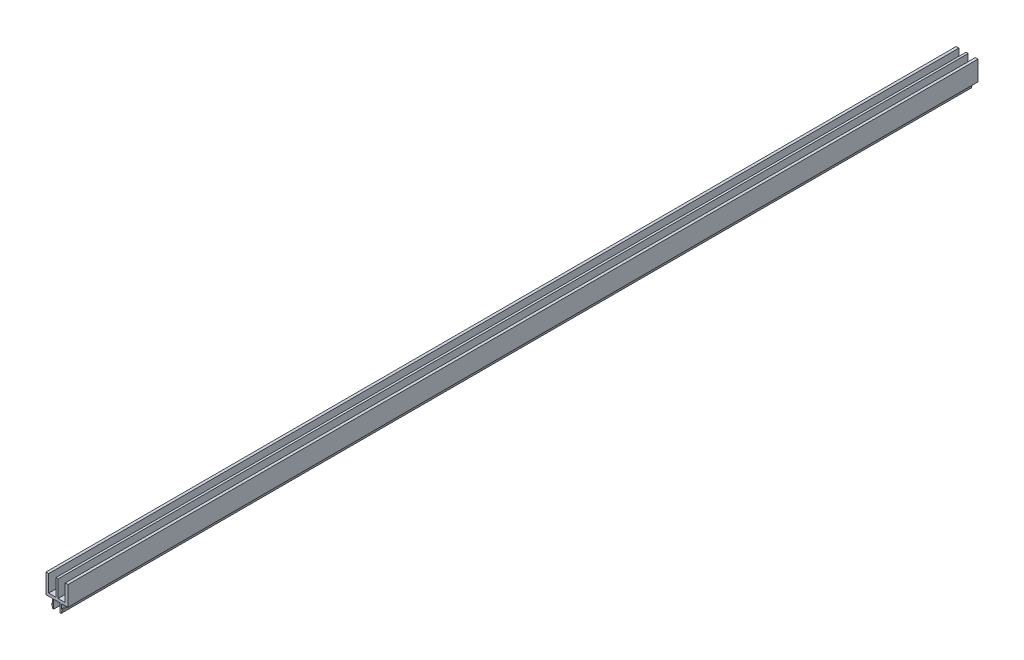
ISO-10303-21;
HEADER;
FILE_DESCRIPTION(('STEP AP214'),'2;1');
FILE_NAME('part.step','',(''),(''),'','','');
FILE_SCHEMA(('AUTOMOTIVE_DESIGN { 1 0 10303 214 1 1 1 1 }'));
ENDSEC;
DATA;
#1=APPLICATION_CONTEXT('core data for automotive mechanical design processes');
#2=APPLICATION_PROTOCOL_DEFINITION('international standard','automotive_design',2000,#1);
#3=PRODUCT_CONTEXT('',#1,'mechanical');
#4=PRODUCT('Part','Part','',(#3));
#5=PRODUCT_RELATED_PRODUCT_CATEGORY('part','',(#4));
#6=PRODUCT_DEFINITION_FORMATION('','',#4);
#7=PRODUCT_DEFINITION_CONTEXT('part definition',#1,'design');
#8=PRODUCT_DEFINITION('design','',#6,#7);
#9=PRODUCT_DEFINITION_SHAPE('','',#8);
#10=(LENGTH_UNIT() NAMED_UNIT(*) SI_UNIT(.MILLI.,.METRE.));
#11=(NAMED_UNIT(*) PLANE_ANGLE_UNIT() SI_UNIT($,.RADIAN.));
#12=(NAMED_UNIT(*) SI_UNIT($,.STERADIAN.) SOLID_ANGLE_UNIT());
#13=UNCERTAINTY_MEASURE_WITH_UNIT(LENGTH_MEASURE(1.E-05),#10,'distance_accuracy_value','');
#14=(GEOMETRIC_REPRESENTATION_CONTEXT(3) GLOBAL_UNCERTAINTY_ASSIGNED_CONTEXT((#13)) GLOBAL_UNIT_ASSIGNED_CONTEXT((#10,
#11,#12)) REPRESENTATION_CONTEXT('',''));
#15=CARTESIAN_POINT('',(0.,0.,0.));
#16=DIRECTION('',(0.,0.,1.));
#17=DIRECTION('',(1.,0.,0.));
#18=AXIS2_PLACEMENT_3D('',#15,#16,#17);
#19=CARTESIAN_POINT('',(-1.,17.9999999975,-782.));
#20=DIRECTION('',(-1.,0.,0.));
#21=DIRECTION('',(0.,-1.,0.));
#22=AXIS2_PLACEMENT_3D('',#19,#20,#21);
#23=PLANE('',#22);
#24=DIRECTION('',(0.,-1.,0.));
#25=VECTOR('',#24,1.);
#26=CARTESIAN_POINT('',(-1.,17.9999999975,50.));
#27=LINE('',#26,#25);
#28=CARTESIAN_POINT('',(-1.,17.9999999975,50.));
#29=VERTEX_POINT('',#28);
#30=CARTESIAN_POINT('',(-1.,2.4999999995,50.));
#31=VERTEX_POINT('',#30);
#32=EDGE_CURVE('E226',#29,#31,#27,.T.);
#33=ORIENTED_EDGE('',*,*,#32,.F.);
#34=DIRECTION('',(0.,0.,1.));
#35=VECTOR('',#34,1.);
#36=CARTESIAN_POINT('',(-1.,17.9999999975,-782.));
#37=LINE('',#36,#35);
#38=CARTESIAN_POINT('',(-1.,17.9999999975,-782.));
#39=VERTEX_POINT('',#38);
#40=EDGE_CURVE('E11',#39,#29,#37,.T.);
#41=ORIENTED_EDGE('',*,*,#40,.F.);
#42=DIRECTION('',(0.,-1.,0.));
#43=VECTOR('',#42,1.);
#44=CARTESIAN_POINT('',(-1.,17.9999999975,-782.));
#45=LINE('',#44,#43);
#46=CARTESIAN_POINT('',(-1.,2.4999999995,-782.));
#47=VERTEX_POINT('',#46);
#48=EDGE_CURVE('E294',#39,#47,#45,.T.);
#49=ORIENTED_EDGE('',*,*,#48,.T.);
#50=DIRECTION('',(0.,0.,1.));
#51=VECTOR('',#50,1.);
#52=CARTESIAN_POINT('',(-1.,2.4999999995,-782.));
#53=LINE('',#52,#51);
#54=EDGE_CURVE('E36',#47,#31,#53,.T.);
#55=ORIENTED_EDGE('',*,*,#54,.T.);
#56=EDGE_LOOP('',(#33,#41,#49,#55));
#57=FACE_BOUND('',#56,.T.);
#58=ADVANCED_FACE('F33',(#57),#23,.T.);
#59=CARTESIAN_POINT('',(0.999999999999998,17.9999999975,-782.));
#60=DIRECTION('',(0.,1.,0.));
#61=DIRECTION('',(0.,0.,1.));
#62=AXIS2_PLACEMENT_3D('',#59,#60,#61);
#63=PLANE('',#62);
#64=DIRECTION('',(-1.,0.,0.));
#65=VECTOR('',#64,1.);
#66=CARTESIAN_POINT('',(0.999999999999998,17.9999999975,50.));
#67=LINE('',#66,#65);
#68=CARTESIAN_POINT('',(0.999999999999998,17.9999999975,50.));
#69=VERTEX_POINT('',#68);
#70=EDGE_CURVE('E292',#69,#29,#67,.T.);
#71=ORIENTED_EDGE('',*,*,#70,.F.);
#72=DIRECTION('',(0.,0.,1.));
#73=VECTOR('',#72,1.);
#74=CARTESIAN_POINT('',(0.999999999999998,17.9999999975,-782.));
#75=LINE('',#74,#73);
#76=CARTESIAN_POINT('',(0.999999999999998,17.9999999975,-782.));
#77=VERTEX_POINT('',#76);
#78=EDGE_CURVE('E42',#77,#69,#75,.T.);
#79=ORIENTED_EDGE('',*,*,#78,.F.);
#80=DIRECTION('',(-1.,0.,0.));
#81=VECTOR('',#80,1.);
#82=CARTESIAN_POINT('',(0.999999999999998,17.9999999975,-782.));
#83=LINE('',#82,#81);
#84=EDGE_CURVE('E216',#77,#39,#83,.T.);
#85=ORIENTED_EDGE('',*,*,#84,.T.);
#86=ORIENTED_EDGE('',*,*,#40,.T.);
#87=EDGE_LOOP('',(#71,#79,#85,#86));
#88=FACE_BOUND('',#87,.T.);
#89=ADVANCED_FACE('F338',(#88),#63,.T.);
#90=CARTESIAN_POINT('',(0.999999999999998,2.4999999995,-782.));
#91=DIRECTION('',(1.,0.,0.));
#92=DIRECTION('',(0.,0.,-1.));
#93=AXIS2_PLACEMENT_3D('',#90,#91,#92);
#94=PLANE('',#93);
#95=DIRECTION('',(0.,1.,0.));
#96=VECTOR('',#95,1.);
#97=CARTESIAN_POINT('',(0.999999999999998,2.4999999995,50.));
#98=LINE('',#97,#96);
#99=CARTESIAN_POINT('',(0.999999999999998,2.4999999995,50.));
#100=VERTEX_POINT('',#99);
#101=EDGE_CURVE('E203',#100,#69,#98,.T.);
#102=ORIENTED_EDGE('',*,*,#101,.F.);
#103=DIRECTION('',(0.,0.,1.));
#104=VECTOR('',#103,1.);
#105=CARTESIAN_POINT('',(0.999999999999998,2.4999999995,-782.));
#106=LINE('',#105,#104);
#107=CARTESIAN_POINT('',(0.999999999999998,2.4999999995,-782.));
#108=VERTEX_POINT('',#107);
#109=EDGE_CURVE('E198',#108,#100,#106,.T.);
#110=ORIENTED_EDGE('',*,*,#109,.F.);
#111=DIRECTION('',(0.,1.,0.));
#112=VECTOR('',#111,1.);
#113=CARTESIAN_POINT('',(0.999999999999998,2.4999999995,-782.));
#114=LINE('',#113,#112);
#115=EDGE_CURVE('E201',#108,#77,#114,.T.);
#116=ORIENTED_EDGE('',*,*,#115,.T.);
#117=ORIENTED_EDGE('',*,*,#78,.T.);
#118=EDGE_LOOP('',(#102,#110,#116,#117));
#119=FACE_BOUND('',#118,.T.);
#120=ADVANCED_FACE('F200',(#119),#94,.T.);
#121=CARTESIAN_POINT('',(7.5,2.4999999995,-782.));
#122=DIRECTION('',(0.,1.,0.));
#123=DIRECTION('',(-1.,0.,0.));
#124=AXIS2_PLACEMENT_3D('',#121,#122,#123);
#125=PLANE('',#124);
#126=DIRECTION('',(-1.,0.,0.));
#127=VECTOR('',#126,1.);
#128=CARTESIAN_POINT('',(7.5,2.4999999995,50.));
#129=LINE('',#128,#127);
#130=CARTESIAN_POINT('',(7.5,2.4999999995,50.));
#131=VERTEX_POINT('',#130);
#132=EDGE_CURVE('E289',#131,#100,#129,.T.);
#133=ORIENTED_EDGE('',*,*,#132,.F.);
#134=DIRECTION('',(0.,0.,1.));
#135=VECTOR('',#134,1.);
#136=CARTESIAN_POINT('',(7.5,2.4999999995,-782.));
#137=LINE('',#136,#135);
#138=CARTESIAN_POINT('',(7.5,2.4999999995,-782.));
#139=VERTEX_POINT('',#138);
#140=EDGE_CURVE('E208',#139,#131,#137,.T.);
#141=ORIENTED_EDGE('',*,*,#140,.F.);
#142=DIRECTION('',(-1.,0.,0.));
#143=VECTOR('',#142,1.);
#144=CARTESIAN_POINT('',(7.5,2.4999999995,-782.));
#145=LINE('',#144,#143);
#146=EDGE_CURVE('E214',#139,#108,#145,.T.);
#147=ORIENTED_EDGE('',*,*,#146,.T.);
#148=ORIENTED_EDGE('',*,*,#109,.T.);
#149=EDGE_LOOP('',(#133,#141,#147,#148));
#150=FACE_BOUND('',#149,.T.);
#151=ADVANCED_FACE('F218',(#150),#125,.T.);
#152=CARTESIAN_POINT('',(7.5,17.9999999975,-782.));
#153=DIRECTION('',(-1.,0.,0.));
#154=DIRECTION('',(0.,-1.,0.));
#155=AXIS2_PLACEMENT_3D('',#152,#153,#154);
#156=PLANE('',#155);
#157=DIRECTION('',(0.,-1.,0.));
#158=VECTOR('',#157,1.);
#159=CARTESIAN_POINT('',(7.5,17.9999999975,50.));
#160=LINE('',#159,#158);
#161=CARTESIAN_POINT('',(7.5,17.9999999975,50.));
#162=VERTEX_POINT('',#161);
#163=EDGE_CURVE('E286',#162,#131,#160,.T.);
#164=ORIENTED_EDGE('',*,*,#163,.F.);
#165=DIRECTION('',(0.,0.,1.));
#166=VECTOR('',#165,1.);
#167=CARTESIAN_POINT('',(7.5,17.9999999975,-782.));
#168=LINE('',#167,#166);
#169=CARTESIAN_POINT('',(7.5,17.9999999975,-782.));
#170=VERTEX_POINT('',#169);
#171=EDGE_CURVE('E298',#170,#162,#168,.T.);
#172=ORIENTED_EDGE('',*,*,#171,.F.);
#173=DIRECTION('',(0.,-1.,0.));
#174=VECTOR('',#173,1.);
#175=CARTESIAN_POINT('',(7.5,17.9999999975,-782.));
#176=LINE('',#175,#174);
#177=EDGE_CURVE('E219',#170,#139,#176,.T.);
#178=ORIENTED_EDGE('',*,*,#177,.T.);
#179=ORIENTED_EDGE('',*,*,#140,.T.);
#180=EDGE_LOOP('',(#164,#172,#178,#179));
#181=FACE_BOUND('',#180,.T.);
#182=ADVANCED_FACE('F351',(#181),#156,.T.);
#183=CARTESIAN_POINT('',(10.,17.9999999975,-782.));
#184=DIRECTION('',(0.,1.,0.));
#185=DIRECTION('',(0.,0.,1.));
#186=AXIS2_PLACEMENT_3D('',#183,#184,#185);
#187=PLANE('',#186);
#188=DIRECTION('',(-1.,0.,0.));
#189=VECTOR('',#188,1.);
#190=CARTESIAN_POINT('',(10.,17.9999999975,50.));
#191=LINE('',#190,#189);
#192=CARTESIAN_POINT('',(10.,17.9999999975,50.));
#193=VERTEX_POINT('',#192);
#194=EDGE_CURVE('E283',#193,#162,#191,.T.);
#195=ORIENTED_EDGE('',*,*,#194,.F.);
#196=DIRECTION('',(0.,0.,1.));
#197=VECTOR('',#196,1.);
#198=CARTESIAN_POINT('',(10.,17.9999999975,-782.));
#199=LINE('',#198,#197);
#200=CARTESIAN_POINT('',(10.,17.9999999975,-782.));
#201=VERTEX_POINT('',#200);
#202=EDGE_CURVE('E300',#201,#193,#199,.T.);
#203=ORIENTED_EDGE('',*,*,#202,.F.);
#204=DIRECTION('',(-1.,0.,0.));
#205=VECTOR('',#204,1.);
#206=CARTESIAN_POINT('',(10.,17.9999999975,-782.));
#207=LINE('',#206,#205);
#208=EDGE_CURVE('E221',#201,#170,#207,.T.);
#209=ORIENTED_EDGE('',*,*,#208,.T.);
#210=ORIENTED_EDGE('',*,*,#171,.T.);
#211=EDGE_LOOP('',(#195,#203,#209,#210));
#212=FACE_BOUND('',#211,.T.);
#213=ADVANCED_FACE('F354',(#212),#187,.T.);
#214=CARTESIAN_POINT('',(10.,-4.99999828349541E-10,-782.));
#215=DIRECTION('',(1.,0.,0.));
#216=DIRECTION('',(0.,0.,-1.));
#217=AXIS2_PLACEMENT_3D('',#214,#215,#216);
#218=PLANE('',#217);
#219=DIRECTION('',(0.,1.,0.));
#220=VECTOR('',#219,1.);
#221=CARTESIAN_POINT('',(10.,-4.99999828349541E-10,50.));
#222=LINE('',#221,#220);
#223=CARTESIAN_POINT('',(10.,-4.99999828349541E-10,50.));
#224=VERTEX_POINT('',#223);
#225=EDGE_CURVE('E280',#224,#193,#222,.T.);
#226=ORIENTED_EDGE('',*,*,#225,.F.);
#227=DIRECTION('',(0.,0.,1.));
#228=VECTOR('',#227,1.);
#229=CARTESIAN_POINT('',(10.,-4.99999828349541E-10,-782.));
#230=LINE('',#229,#228);
#231=CARTESIAN_POINT('',(10.,-4.99999828349541E-10,-782.));
#232=VERTEX_POINT('',#231);
#233=EDGE_CURVE('E302',#232,#224,#230,.T.);
#234=ORIENTED_EDGE('',*,*,#233,.F.);
#235=DIRECTION('',(0.,1.,0.));
#236=VECTOR('',#235,1.);
#237=CARTESIAN_POINT('',(10.,-4.99999828349541E-10,-782.));
#238=LINE('',#237,#236);
#239=EDGE_CURVE('E644',#232,#201,#238,.T.);
#240=ORIENTED_EDGE('',*,*,#239,.T.);
#241=ORIENTED_EDGE('',*,*,#202,.T.);
#242=EDGE_LOOP('',(#226,#234,#240,#241));
#243=FACE_BOUND('',#242,.T.);
#244=ADVANCED_FACE('F358',(#243),#218,.T.);
#245=CARTESIAN_POINT('',(4.,-4.99999998002099E-10,-782.));
#246=DIRECTION('',(0.,-1.,0.));
#247=DIRECTION('',(1.,0.,0.));
#248=AXIS2_PLACEMENT_3D('',#245,#246,#247);
#249=PLANE('',#248);
#250=DIRECTION('',(1.,0.,0.));
#251=VECTOR('',#250,1.);
#252=CARTESIAN_POINT('',(4.,-4.99999998002099E-10,50.));
#253=LINE('',#252,#251);
#254=CARTESIAN_POINT('',(4.,-4.99999998002099E-10,50.));
#255=VERTEX_POINT('',#254);
#256=EDGE_CURVE('E277',#255,#224,#253,.T.);
#257=ORIENTED_EDGE('',*,*,#256,.F.);
#258=DIRECTION('',(0.,0.,1.));
#259=VECTOR('',#258,1.);
#260=CARTESIAN_POINT('',(4.,-4.99999998002099E-10,-782.));
#261=LINE('',#260,#259);
#262=CARTESIAN_POINT('',(4.,-4.99999998002099E-10,-782.));
#263=VERTEX_POINT('',#262);
#264=EDGE_CURVE('E304',#263,#255,#261,.T.);
#265=ORIENTED_EDGE('',*,*,#264,.F.);
#266=DIRECTION('',(1.,0.,0.));
#267=VECTOR('',#266,1.);
#268=CARTESIAN_POINT('',(4.,-4.99999998002099E-10,-782.));
#269=LINE('',#268,#267);
#270=EDGE_CURVE('E648',#263,#232,#269,.T.);
#271=ORIENTED_EDGE('',*,*,#270,.T.);
#272=ORIENTED_EDGE('',*,*,#233,.T.);
#273=EDGE_LOOP('',(#257,#265,#271,#272));
#274=FACE_BOUND('',#273,.T.);
#275=ADVANCED_FACE('F362',(#274),#249,.T.);
#276=CARTESIAN_POINT('',(4.,-4.5,-782.));
#277=DIRECTION('',(1.,0.,0.));
#278=DIRECTION('',(0.,0.,-1.));
#279=AXIS2_PLACEMENT_3D('',#276,#277,#278);
#280=PLANE('',#279);
#281=DIRECTION('',(0.,1.,0.));
#282=VECTOR('',#281,1.);
#283=CARTESIAN_POINT('',(4.,-4.5,50.));
#284=LINE('',#283,#282);
#285=CARTESIAN_POINT('',(4.,-4.5,50.));
#286=VERTEX_POINT('',#285);
#287=EDGE_CURVE('E274',#286,#255,#284,.T.);
#288=ORIENTED_EDGE('',*,*,#287,.F.);
#289=DIRECTION('',(0.,0.,1.));
#290=VECTOR('',#289,1.);
#291=CARTESIAN_POINT('',(4.,-4.5,-782.));
#292=LINE('',#291,#290);
#293=CARTESIAN_POINT('',(4.,-4.5,-782.));
#294=VERTEX_POINT('',#293);
#295=EDGE_CURVE('E306',#294,#286,#292,.T.);
#296=ORIENTED_EDGE('',*,*,#295,.F.);
#297=DIRECTION('',(0.,1.,0.));
#298=VECTOR('',#297,1.);
#299=CARTESIAN_POINT('',(4.,-4.5,-782.));
#300=LINE('',#299,#298);
#301=EDGE_CURVE('E637',#294,#263,#300,.T.);
#302=ORIENTED_EDGE('',*,*,#301,.T.);
#303=ORIENTED_EDGE('',*,*,#264,.T.);
#304=EDGE_LOOP('',(#288,#296,#302,#303));
#305=FACE_BOUND('',#304,.T.);
#306=ADVANCED_FACE('F366',(#305),#280,.T.);
#307=CARTESIAN_POINT('',(5.,-4.5,-782.));
#308=DIRECTION('',(0.,1.,0.));
#309=DIRECTION('',(0.,0.,1.));
#310=AXIS2_PLACEMENT_3D('',#307,#308,#309);
#311=PLANE('',#310);
#312=DIRECTION('',(-1.,0.,0.));
#313=VECTOR('',#312,1.);
#314=CARTESIAN_POINT('',(5.,-4.5,50.));
#315=LINE('',#314,#313);
#316=CARTESIAN_POINT('',(5.,-4.5,50.));
#317=VERTEX_POINT('',#316);
#318=EDGE_CURVE('E271',#317,#286,#315,.T.);
#319=ORIENTED_EDGE('',*,*,#318,.F.);
#320=DIRECTION('',(0.,0.,1.));
#321=VECTOR('',#320,1.);
#322=CARTESIAN_POINT('',(5.,-4.5,-782.));
#323=LINE('',#322,#321);
#324=CARTESIAN_POINT('',(5.,-4.5,-782.));
#325=VERTEX_POINT('',#324);
#326=EDGE_CURVE('E308',#325,#317,#323,.T.);
#327=ORIENTED_EDGE('',*,*,#326,.F.);
#328=DIRECTION('',(-1.,0.,0.));
#329=VECTOR('',#328,1.);
#330=CARTESIAN_POINT('',(5.,-4.5,-782.));
#331=LINE('',#330,#329);
#332=EDGE_CURVE('E633',#325,#294,#331,.T.);
#333=ORIENTED_EDGE('',*,*,#332,.T.);
#334=ORIENTED_EDGE('',*,*,#295,.T.);
#335=EDGE_LOOP('',(#319,#327,#333,#334));
#336=FACE_BOUND('',#335,.T.);
#337=ADVANCED_FACE('F370',(#336),#311,.T.);
#338=CARTESIAN_POINT('',(3.75,-8.,-782.));
#339=DIRECTION('',(0.941741911594837,-0.336336396998157,0.));
#340=DIRECTION('',(0.336336396998157,0.941741911594837,0.));
#341=AXIS2_PLACEMENT_3D('',#338,#339,#340);
#342=PLANE('',#341);
#343=DIRECTION('',(0.336336396998157,0.941741911594837,0.));
#344=VECTOR('',#343,1.);
#345=CARTESIAN_POINT('',(3.75,-8.,50.));
#346=LINE('',#345,#344);
#347=CARTESIAN_POINT('',(3.75,-8.,50.));
#348=VERTEX_POINT('',#347);
#349=EDGE_CURVE('E268',#348,#317,#346,.T.);
#350=ORIENTED_EDGE('',*,*,#349,.F.);
#351=DIRECTION('',(0.,0.,1.));
#352=VECTOR('',#351,1.);
#353=CARTESIAN_POINT('',(3.75,-8.,-782.));
#354=LINE('',#353,#352);
#355=CARTESIAN_POINT('',(3.75,-8.,-782.));
#356=VERTEX_POINT('',#355);
#357=EDGE_CURVE('E310',#356,#348,#354,.T.);
#358=ORIENTED_EDGE('',*,*,#357,.F.);
#359=DIRECTION('',(0.336336396998157,0.941741911594837,0.));
#360=VECTOR('',#359,1.);
#361=CARTESIAN_POINT('',(3.75,-8.,-782.));
#362=LINE('',#361,#360);
#363=EDGE_CURVE('E654',#356,#325,#362,.T.);
#364=ORIENTED_EDGE('',*,*,#363,.T.);
#365=ORIENTED_EDGE('',*,*,#326,.T.);
#366=EDGE_LOOP('',(#350,#358,#364,#365));
#367=FACE_BOUND('',#366,.T.);
#368=ADVANCED_FACE('F374',(#367),#342,.T.);
#369=CARTESIAN_POINT('',(3.,-8.,-782.));
#370=DIRECTION('',(0.,-1.,0.));
#371=DIRECTION('',(0.,0.,-1.));
#372=AXIS2_PLACEMENT_3D('',#369,#370,#371);
#373=PLANE('',#372);
#374=DIRECTION('',(1.,0.,0.));
#375=VECTOR('',#374,1.);
#376=CARTESIAN_POINT('',(3.,-8.,50.));
#377=LINE('',#376,#375);
#378=CARTESIAN_POINT('',(3.,-8.,50.));
#379=VERTEX_POINT('',#378);
#380=EDGE_CURVE('E265',#379,#348,#377,.T.);
#381=ORIENTED_EDGE('',*,*,#380,.F.);
#382=DIRECTION('',(0.,0.,1.));
#383=VECTOR('',#382,1.);
#384=CARTESIAN_POINT('',(3.,-8.,-782.));
#385=LINE('',#384,#383);
#386=CARTESIAN_POINT('',(3.,-8.,-782.));
#387=VERTEX_POINT('',#386);
#388=EDGE_CURVE('E312',#387,#379,#385,.T.);
#389=ORIENTED_EDGE('',*,*,#388,.F.);
#390=DIRECTION('',(1.,0.,0.));
#391=VECTOR('',#390,1.);
#392=CARTESIAN_POINT('',(3.,-8.,-782.));
#393=LINE('',#392,#391);
#394=EDGE_CURVE('E626',#387,#356,#393,.T.);
#395=ORIENTED_EDGE('',*,*,#394,.T.);
#396=ORIENTED_EDGE('',*,*,#357,.T.);
#397=EDGE_LOOP('',(#381,#389,#395,#396));
#398=FACE_BOUND('',#397,.T.);
#399=ADVANCED_FACE('F378',(#398),#373,.T.);
#400=CARTESIAN_POINT('',(3.,-4.9999985194348E-10,-782.));
#401=DIRECTION('',(-1.,0.,0.));
#402=DIRECTION('',(0.,0.,1.));
#403=AXIS2_PLACEMENT_3D('',#400,#401,#402);
#404=PLANE('',#403);
#405=DIRECTION('',(0.,-1.,0.));
#406=VECTOR('',#405,1.);
#407=CARTESIAN_POINT('',(3.,-4.9999985194348E-10,50.));
#408=LINE('',#407,#406);
#409=CARTESIAN_POINT('',(3.,-4.9999985194348E-10,50.));
#410=VERTEX_POINT('',#409);
#411=EDGE_CURVE('E262',#410,#379,#408,.T.);
#412=ORIENTED_EDGE('',*,*,#411,.F.);
#413=DIRECTION('',(0.,0.,1.));
#414=VECTOR('',#413,1.);
#415=CARTESIAN_POINT('',(3.,-4.9999985194348E-10,-782.));
#416=LINE('',#415,#414);
#417=CARTESIAN_POINT('',(3.,-4.9999985194348E-10,-782.));
#418=VERTEX_POINT('',#417);
#419=EDGE_CURVE('E314',#418,#410,#416,.T.);
#420=ORIENTED_EDGE('',*,*,#419,.F.);
#421=DIRECTION('',(0.,-1.,0.));
#422=VECTOR('',#421,1.);
#423=CARTESIAN_POINT('',(3.,-4.9999985194348E-10,-782.));
#424=LINE('',#423,#422);
#425=EDGE_CURVE('E622',#418,#387,#424,.T.);
#426=ORIENTED_EDGE('',*,*,#425,.T.);
#427=ORIENTED_EDGE('',*,*,#388,.T.);
#428=EDGE_LOOP('',(#412,#420,#426,#427));
#429=FACE_BOUND('',#428,.T.);
#430=ADVANCED_FACE('F382',(#429),#404,.T.);
#431=CARTESIAN_POINT('',(-3.,-4.99999455901012E-10,-782.));
#432=DIRECTION('',(0.,-1.,0.));
#433=DIRECTION('',(1.,0.,0.));
#434=AXIS2_PLACEMENT_3D('',#431,#432,#433);
#435=PLANE('',#434);
#436=DIRECTION('',(1.,0.,0.));
#437=VECTOR('',#436,1.);
#438=CARTESIAN_POINT('',(-3.,-4.99999455901012E-10,50.));
#439=LINE('',#438,#437);
#440=CARTESIAN_POINT('',(-3.,-4.99999455901012E-10,50.));
#441=VERTEX_POINT('',#440);
#442=EDGE_CURVE('E259',#441,#410,#439,.T.);
#443=ORIENTED_EDGE('',*,*,#442,.F.);
#444=DIRECTION('',(0.,0.,1.));
#445=VECTOR('',#444,1.);
#446=CARTESIAN_POINT('',(-3.,-4.99999455901012E-10,-782.));
#447=LINE('',#446,#445);
#448=CARTESIAN_POINT('',(-3.,-4.99999455901012E-10,-782.));
#449=VERTEX_POINT('',#448);
#450=EDGE_CURVE('E316',#449,#441,#447,.T.);
#451=ORIENTED_EDGE('',*,*,#450,.F.);
#452=DIRECTION('',(1.,0.,0.));
#453=VECTOR('',#452,1.);
#454=CARTESIAN_POINT('',(-3.,-4.99999455901012E-10,-782.));
#455=LINE('',#454,#453);
#456=EDGE_CURVE('E658',#449,#418,#455,.T.);
#457=ORIENTED_EDGE('',*,*,#456,.T.);
#458=ORIENTED_EDGE('',*,*,#419,.T.);
#459=EDGE_LOOP('',(#443,#451,#457,#458));
#460=FACE_BOUND('',#459,.T.);
#461=ADVANCED_FACE('F386',(#460),#435,.T.);
#462=CARTESIAN_POINT('',(-3.,-8.,-782.));
#463=DIRECTION('',(1.,0.,0.));
#464=DIRECTION('',(0.,0.,-1.));
#465=AXIS2_PLACEMENT_3D('',#462,#463,#464);
#466=PLANE('',#465);
#467=DIRECTION('',(0.,1.,0.));
#468=VECTOR('',#467,1.);
#469=CARTESIAN_POINT('',(-3.,-8.,50.));
#470=LINE('',#469,#468);
#471=CARTESIAN_POINT('',(-3.,-8.,50.));
#472=VERTEX_POINT('',#471);
#473=EDGE_CURVE('E256',#472,#441,#470,.T.);
#474=ORIENTED_EDGE('',*,*,#473,.F.);
#475=DIRECTION('',(0.,0.,1.));
#476=VECTOR('',#475,1.);
#477=CARTESIAN_POINT('',(-3.,-8.,-782.));
#478=LINE('',#477,#476);
#479=CARTESIAN_POINT('',(-3.,-8.,-782.));
#480=VERTEX_POINT('',#479);
#481=EDGE_CURVE('E318',#480,#472,#478,.T.);
#482=ORIENTED_EDGE('',*,*,#481,.F.);
#483=DIRECTION('',(0.,1.,0.));
#484=VECTOR('',#483,1.);
#485=CARTESIAN_POINT('',(-3.,-8.,-782.));
#486=LINE('',#485,#484);
#487=EDGE_CURVE('E615',#480,#449,#486,.T.);
#488=ORIENTED_EDGE('',*,*,#487,.T.);
#489=ORIENTED_EDGE('',*,*,#450,.T.);
#490=EDGE_LOOP('',(#474,#482,#488,#489));
#491=FACE_BOUND('',#490,.T.);
#492=ADVANCED_FACE('F390',(#491),#466,.T.);
#493=CARTESIAN_POINT('',(-3.75,-8.,-782.));
#494=DIRECTION('',(0.,-1.,0.));
#495=DIRECTION('',(0.,0.,-1.));
#496=AXIS2_PLACEMENT_3D('',#493,#494,#495);
#497=PLANE('',#496);
#498=DIRECTION('',(1.,0.,0.));
#499=VECTOR('',#498,1.);
#500=CARTESIAN_POINT('',(-3.75,-8.,50.));
#501=LINE('',#500,#499);
#502=CARTESIAN_POINT('',(-3.75,-8.,50.));
#503=VERTEX_POINT('',#502);
#504=EDGE_CURVE('E253',#503,#472,#501,.T.);
#505=ORIENTED_EDGE('',*,*,#504,.F.);
#506=DIRECTION('',(0.,0.,1.));
#507=VECTOR('',#506,1.);
#508=CARTESIAN_POINT('',(-3.75,-8.,-782.));
#509=LINE('',#508,#507);
#510=CARTESIAN_POINT('',(-3.75,-8.,-782.));
#511=VERTEX_POINT('',#510);
#512=EDGE_CURVE('E320',#511,#503,#509,.T.);
#513=ORIENTED_EDGE('',*,*,#512,.F.);
#514=DIRECTION('',(1.,0.,0.));
#515=VECTOR('',#514,1.);
#516=CARTESIAN_POINT('',(-3.75,-8.,-782.));
#517=LINE('',#516,#515);
#518=EDGE_CURVE('E611',#511,#480,#517,.T.);
#519=ORIENTED_EDGE('',*,*,#518,.T.);
#520=ORIENTED_EDGE('',*,*,#481,.T.);
#521=EDGE_LOOP('',(#505,#513,#519,#520));
#522=FACE_BOUND('',#521,.T.);
#523=ADVANCED_FACE('F394',(#522),#497,.T.);
#524=CARTESIAN_POINT('',(-5.,-4.5,-782.));
#525=DIRECTION('',(-0.941741911594837,-0.336336396998156,0.));
#526=DIRECTION('',(0.336336396998156,-0.941741911594838,0.));
#527=AXIS2_PLACEMENT_3D('',#524,#525,#526);
#528=PLANE('',#527);
#529=DIRECTION('',(0.336336396998156,-0.941741911594837,0.));
#530=VECTOR('',#529,1.);
#531=CARTESIAN_POINT('',(-5.,-4.5,50.));
#532=LINE('',#531,#530);
#533=CARTESIAN_POINT('',(-5.,-4.5,50.));
#534=VERTEX_POINT('',#533);
#535=EDGE_CURVE('E250',#534,#503,#532,.T.);
#536=ORIENTED_EDGE('',*,*,#535,.F.);
#537=DIRECTION('',(0.,0.,1.));
#538=VECTOR('',#537,1.);
#539=CARTESIAN_POINT('',(-5.,-4.5,-782.));
#540=LINE('',#539,#538);
#541=CARTESIAN_POINT('',(-5.,-4.5,-782.));
#542=VERTEX_POINT('',#541);
#543=EDGE_CURVE('E322',#542,#534,#540,.T.);
#544=ORIENTED_EDGE('',*,*,#543,.F.);
#545=DIRECTION('',(0.336336396998156,-0.941741911594837,0.));
#546=VECTOR('',#545,1.);
#547=CARTESIAN_POINT('',(-5.,-4.5,-782.));
#548=LINE('',#547,#546);
#549=EDGE_CURVE('E662',#542,#511,#548,.T.);
#550=ORIENTED_EDGE('',*,*,#549,.T.);
#551=ORIENTED_EDGE('',*,*,#512,.T.);
#552=EDGE_LOOP('',(#536,#544,#550,#551));
#553=FACE_BOUND('',#552,.T.);
#554=ADVANCED_FACE('F398',(#553),#528,.T.);
#555=CARTESIAN_POINT('',(-4.,-4.5,-782.));
#556=DIRECTION('',(0.,1.,0.));
#557=DIRECTION('',(0.,0.,1.));
#558=AXIS2_PLACEMENT_3D('',#555,#556,#557);
#559=PLANE('',#558);
#560=DIRECTION('',(-1.,0.,0.));
#561=VECTOR('',#560,1.);
#562=CARTESIAN_POINT('',(-4.,-4.5,50.));
#563=LINE('',#562,#561);
#564=CARTESIAN_POINT('',(-4.,-4.5,50.));
#565=VERTEX_POINT('',#564);
#566=EDGE_CURVE('E247',#565,#534,#563,.T.);
#567=ORIENTED_EDGE('',*,*,#566,.F.);
#568=DIRECTION('',(0.,0.,1.));
#569=VECTOR('',#568,1.);
#570=CARTESIAN_POINT('',(-4.,-4.5,-782.));
#571=LINE('',#570,#569);
#572=CARTESIAN_POINT('',(-4.,-4.5,-782.));
#573=VERTEX_POINT('',#572);
#574=EDGE_CURVE('E324',#573,#565,#571,.T.);
#575=ORIENTED_EDGE('',*,*,#574,.F.);
#576=DIRECTION('',(-1.,0.,0.));
#577=VECTOR('',#576,1.);
#578=CARTESIAN_POINT('',(-4.,-4.5,-782.));
#579=LINE('',#578,#577);
#580=EDGE_CURVE('E604',#573,#542,#579,.T.);
#581=ORIENTED_EDGE('',*,*,#580,.T.);
#582=ORIENTED_EDGE('',*,*,#543,.T.);
#583=EDGE_LOOP('',(#567,#575,#581,#582));
#584=FACE_BOUND('',#583,.T.);
#585=ADVANCED_FACE('F402',(#584),#559,.T.);
#586=CARTESIAN_POINT('',(-4.,-4.9999985194348E-10,-782.));
#587=DIRECTION('',(-1.,0.,0.));
#588=DIRECTION('',(0.,0.,1.));
#589=AXIS2_PLACEMENT_3D('',#586,#587,#588);
#590=PLANE('',#589);
#591=DIRECTION('',(0.,-1.,0.));
#592=VECTOR('',#591,1.);
#593=CARTESIAN_POINT('',(-4.,-4.9999985194348E-10,50.));
#594=LINE('',#593,#592);
#595=CARTESIAN_POINT('',(-4.,-4.9999985194348E-10,50.));
#596=VERTEX_POINT('',#595);
#597=EDGE_CURVE('E244',#596,#565,#594,.T.);
#598=ORIENTED_EDGE('',*,*,#597,.F.);
#599=DIRECTION('',(0.,0.,1.));
#600=VECTOR('',#599,1.);
#601=CARTESIAN_POINT('',(-4.,-4.9999985194348E-10,-782.));
#602=LINE('',#601,#600);
#603=CARTESIAN_POINT('',(-4.,-4.9999985194348E-10,-782.));
#604=VERTEX_POINT('',#603);
#605=EDGE_CURVE('E326',#604,#596,#602,.T.);
#606=ORIENTED_EDGE('',*,*,#605,.F.);
#607=DIRECTION('',(0.,-1.,0.));
#608=VECTOR('',#607,1.);
#609=CARTESIAN_POINT('',(-4.,-4.9999985194348E-10,-782.));
#610=LINE('',#609,#608);
#611=EDGE_CURVE('E600',#604,#573,#610,.T.);
#612=ORIENTED_EDGE('',*,*,#611,.T.);
#613=ORIENTED_EDGE('',*,*,#574,.T.);
#614=EDGE_LOOP('',(#598,#606,#612,#613));
#615=FACE_BOUND('',#614,.T.);
#616=ADVANCED_FACE('F406',(#615),#590,.T.);
#617=CARTESIAN_POINT('',(-10.,-4.99999719929324E-10,-782.));
#618=DIRECTION('',(0.,-1.,0.));
#619=DIRECTION('',(1.,0.,0.));
#620=AXIS2_PLACEMENT_3D('',#617,#618,#619);
#621=PLANE('',#620);
#622=DIRECTION('',(1.,0.,0.));
#623=VECTOR('',#622,1.);
#624=CARTESIAN_POINT('',(-10.,-4.99999719929324E-10,50.));
#625=LINE('',#624,#623);
#626=CARTESIAN_POINT('',(-10.,-4.99999719929324E-10,50.));
#627=VERTEX_POINT('',#626);
#628=EDGE_CURVE('E241',#627,#596,#625,.T.);
#629=ORIENTED_EDGE('',*,*,#628,.F.);
#630=DIRECTION('',(0.,0.,1.));
#631=VECTOR('',#630,1.);
#632=CARTESIAN_POINT('',(-10.,-4.99999719929324E-10,-782.));
#633=LINE('',#632,#631);
#634=CARTESIAN_POINT('',(-10.,-4.99999719929324E-10,-782.));
#635=VERTEX_POINT('',#634);
#636=EDGE_CURVE('E328',#635,#627,#633,.T.);
#637=ORIENTED_EDGE('',*,*,#636,.F.);
#638=DIRECTION('',(1.,0.,0.));
#639=VECTOR('',#638,1.);
#640=CARTESIAN_POINT('',(-10.,-4.99999719929324E-10,-782.));
#641=LINE('',#640,#639);
#642=EDGE_CURVE('E666',#635,#604,#641,.T.);
#643=ORIENTED_EDGE('',*,*,#642,.T.);
#644=ORIENTED_EDGE('',*,*,#605,.T.);
#645=EDGE_LOOP('',(#629,#637,#643,#644));
#646=FACE_BOUND('',#645,.T.);
#647=ADVANCED_FACE('F410',(#646),#621,.T.);
#648=CARTESIAN_POINT('',(-10.,17.9999999975,-782.));
#649=DIRECTION('',(-1.,0.,0.));
#650=DIRECTION('',(0.,-1.,0.));
#651=AXIS2_PLACEMENT_3D('',#648,#649,#650);
#652=PLANE('',#651);
#653=DIRECTION('',(0.,-1.,0.));
#654=VECTOR('',#653,1.);
#655=CARTESIAN_POINT('',(-10.,17.9999999975,50.));
#656=LINE('',#655,#654);
#657=CARTESIAN_POINT('',(-10.,17.9999999975,50.));
#658=VERTEX_POINT('',#657);
#659=EDGE_CURVE('E238',#658,#627,#656,.T.);
#660=ORIENTED_EDGE('',*,*,#659,.F.);
#661=DIRECTION('',(0.,0.,1.));
#662=VECTOR('',#661,1.);
#663=CARTESIAN_POINT('',(-10.,17.9999999975,-782.));
#664=LINE('',#663,#662);
#665=CARTESIAN_POINT('',(-10.,17.9999999975,-782.));
#666=VERTEX_POINT('',#665);
#667=EDGE_CURVE('E330',#666,#658,#664,.T.);
#668=ORIENTED_EDGE('',*,*,#667,.F.);
#669=DIRECTION('',(0.,-1.,0.));
#670=VECTOR('',#669,1.);
#671=CARTESIAN_POINT('',(-10.,17.9999999975,-782.));
#672=LINE('',#671,#670);
#673=EDGE_CURVE('E593',#666,#635,#672,.T.);
#674=ORIENTED_EDGE('',*,*,#673,.T.);
#675=ORIENTED_EDGE('',*,*,#636,.T.);
#676=EDGE_LOOP('',(#660,#668,#674,#675));
#677=FACE_BOUND('',#676,.T.);
#678=ADVANCED_FACE('F414',(#677),#652,.T.);
#679=CARTESIAN_POINT('',(-7.5,17.9999999975,-782.));
#680=DIRECTION('',(0.,1.,0.));
#681=DIRECTION('',(0.,0.,1.));
#682=AXIS2_PLACEMENT_3D('',#679,#680,#681);
#683=PLANE('',#682);
#684=DIRECTION('',(-1.,0.,0.));
#685=VECTOR('',#684,1.);
#686=CARTESIAN_POINT('',(-7.5,17.9999999975,50.));
#687=LINE('',#686,#685);
#688=CARTESIAN_POINT('',(-7.5,17.9999999975,50.));
#689=VERTEX_POINT('',#688);
#690=EDGE_CURVE('E235',#689,#658,#687,.T.);
#691=ORIENTED_EDGE('',*,*,#690,.F.);
#692=DIRECTION('',(0.,0.,1.));
#693=VECTOR('',#692,1.);
#694=CARTESIAN_POINT('',(-7.5,17.9999999975,-782.));
#695=LINE('',#694,#693);
#696=CARTESIAN_POINT('',(-7.5,17.9999999975,-782.));
#697=VERTEX_POINT('',#696);
#698=EDGE_CURVE('E332',#697,#689,#695,.T.);
#699=ORIENTED_EDGE('',*,*,#698,.F.);
#700=DIRECTION('',(-1.,0.,0.));
#701=VECTOR('',#700,1.);
#702=CARTESIAN_POINT('',(-7.5,17.9999999975,-782.));
#703=LINE('',#702,#701);
#704=EDGE_CURVE('E589',#697,#666,#703,.T.);
#705=ORIENTED_EDGE('',*,*,#704,.T.);
#706=ORIENTED_EDGE('',*,*,#667,.T.);
#707=EDGE_LOOP('',(#691,#699,#705,#706));
#708=FACE_BOUND('',#707,.T.);
#709=ADVANCED_FACE('F418',(#708),#683,.T.);
#710=CARTESIAN_POINT('',(-7.5,2.4999999995,-782.));
#711=DIRECTION('',(1.,0.,0.));
#712=DIRECTION('',(0.,0.,-1.));
#713=AXIS2_PLACEMENT_3D('',#710,#711,#712);
#714=PLANE('',#713);
#715=DIRECTION('',(0.,1.,0.));
#716=VECTOR('',#715,1.);
#717=CARTESIAN_POINT('',(-7.5,2.4999999995,50.));
#718=LINE('',#717,#716);
#719=CARTESIAN_POINT('',(-7.5,2.4999999995,50.));
#720=VERTEX_POINT('',#719);
#721=EDGE_CURVE('E232',#720,#689,#718,.T.);
#722=ORIENTED_EDGE('',*,*,#721,.F.);
#723=DIRECTION('',(0.,0.,1.));
#724=VECTOR('',#723,1.);
#725=CARTESIAN_POINT('',(-7.5,2.4999999995,-782.));
#726=LINE('',#725,#724);
#727=CARTESIAN_POINT('',(-7.5,2.4999999995,-782.));
#728=VERTEX_POINT('',#727);
#729=EDGE_CURVE('E333',#728,#720,#726,.T.);
#730=ORIENTED_EDGE('',*,*,#729,.F.);
#731=DIRECTION('',(0.,1.,0.));
#732=VECTOR('',#731,1.);
#733=CARTESIAN_POINT('',(-7.5,2.4999999995,-782.));
#734=LINE('',#733,#732);
#735=EDGE_CURVE('E670',#728,#697,#734,.T.);
#736=ORIENTED_EDGE('',*,*,#735,.T.);
#737=ORIENTED_EDGE('',*,*,#698,.T.);
#738=EDGE_LOOP('',(#722,#730,#736,#737));
#739=FACE_BOUND('',#738,.T.);
#740=ADVANCED_FACE('F422',(#739),#714,.T.);
#741=CARTESIAN_POINT('',(-1.,2.4999999995,-782.));
#742=DIRECTION('',(0.,1.,0.));
#743=DIRECTION('',(-1.,0.,0.));
#744=AXIS2_PLACEMENT_3D('',#741,#742,#743);
#745=PLANE('',#744);
#746=DIRECTION('',(-1.,0.,0.));
#747=VECTOR('',#746,1.);
#748=CARTESIAN_POINT('',(-1.,2.4999999995,50.));
#749=LINE('',#748,#747);
#750=EDGE_CURVE('E229',#31,#720,#749,.T.);
#751=ORIENTED_EDGE('',*,*,#750,.F.);
#752=ORIENTED_EDGE('',*,*,#54,.F.);
#753=DIRECTION('',(-1.,0.,0.));
#754=VECTOR('',#753,1.);
#755=CARTESIAN_POINT('',(-1.,2.4999999995,-782.));
#756=LINE('',#755,#754);
#757=EDGE_CURVE('E672',#47,#728,#756,.T.);
#758=ORIENTED_EDGE('',*,*,#757,.T.);
#759=ORIENTED_EDGE('',*,*,#729,.T.);
#760=EDGE_LOOP('',(#751,#752,#758,#759));
#761=FACE_BOUND('',#760,.T.);
#762=ADVANCED_FACE('F335',(#761),#745,.T.);
#763=CARTESIAN_POINT('',(0.,0.,-782.));
#764=DIRECTION('',(0.,0.,-1.));
#765=DIRECTION('',(-1.,0.,0.));
#766=AXIS2_PLACEMENT_3D('',#763,#764,#765);
#767=PLANE('',#766);
#768=ORIENTED_EDGE('',*,*,#48,.F.);
#769=ORIENTED_EDGE('',*,*,#84,.F.);
#770=ORIENTED_EDGE('',*,*,#115,.F.);
#771=ORIENTED_EDGE('',*,*,#146,.F.);
#772=ORIENTED_EDGE('',*,*,#177,.F.);
#773=ORIENTED_EDGE('',*,*,#208,.F.);
#774=ORIENTED_EDGE('',*,*,#239,.F.);
#775=ORIENTED_EDGE('',*,*,#270,.F.);
#776=ORIENTED_EDGE('',*,*,#301,.F.);
#777=ORIENTED_EDGE('',*,*,#332,.F.);
#778=ORIENTED_EDGE('',*,*,#363,.F.);
#779=ORIENTED_EDGE('',*,*,#394,.F.);
#780=ORIENTED_EDGE('',*,*,#425,.F.);
#781=ORIENTED_EDGE('',*,*,#456,.F.);
#782=ORIENTED_EDGE('',*,*,#487,.F.);
#783=ORIENTED_EDGE('',*,*,#518,.F.);
#784=ORIENTED_EDGE('',*,*,#549,.F.);
#785=ORIENTED_EDGE('',*,*,#580,.F.);
#786=ORIENTED_EDGE('',*,*,#611,.F.);
#787=ORIENTED_EDGE('',*,*,#642,.F.);
#788=ORIENTED_EDGE('',*,*,#673,.F.);
#789=ORIENTED_EDGE('',*,*,#704,.F.);
#790=ORIENTED_EDGE('',*,*,#735,.F.);
#791=ORIENTED_EDGE('',*,*,#757,.F.);
#792=EDGE_LOOP('',(#768,#769,#770,#771,#772,#773,#774,#775,#776,#777,#778,#779,#780,#781,#782,
#783,#784,#785,#786,#787,#788,#789,#790,#791));
#793=FACE_BOUND('',#792,.T.);
#794=ADVANCED_FACE('F212',(#793),#767,.T.);
#795=CARTESIAN_POINT('',(0.,0.,50.));
#796=DIRECTION('',(0.,0.,-1.));
#797=DIRECTION('',(-1.,0.,0.));
#798=AXIS2_PLACEMENT_3D('',#795,#796,#797);
#799=PLANE('',#798);
#800=ORIENTED_EDGE('',*,*,#32,.T.);
#801=ORIENTED_EDGE('',*,*,#750,.T.);
#802=ORIENTED_EDGE('',*,*,#721,.T.);
#803=ORIENTED_EDGE('',*,*,#690,.T.);
#804=ORIENTED_EDGE('',*,*,#659,.T.);
#805=ORIENTED_EDGE('',*,*,#628,.T.);
#806=ORIENTED_EDGE('',*,*,#597,.T.);
#807=ORIENTED_EDGE('',*,*,#566,.T.);
#808=ORIENTED_EDGE('',*,*,#535,.T.);
#809=ORIENTED_EDGE('',*,*,#504,.T.);
#810=ORIENTED_EDGE('',*,*,#473,.T.);
#811=ORIENTED_EDGE('',*,*,#442,.T.);
#812=ORIENTED_EDGE('',*,*,#411,.T.);
#813=ORIENTED_EDGE('',*,*,#380,.T.);
#814=ORIENTED_EDGE('',*,*,#349,.T.);
#815=ORIENTED_EDGE('',*,*,#318,.T.);
#816=ORIENTED_EDGE('',*,*,#287,.T.);
#817=ORIENTED_EDGE('',*,*,#256,.T.);
#818=ORIENTED_EDGE('',*,*,#225,.T.);
#819=ORIENTED_EDGE('',*,*,#194,.T.);
#820=ORIENTED_EDGE('',*,*,#163,.T.);
#821=ORIENTED_EDGE('',*,*,#132,.T.);
#822=ORIENTED_EDGE('',*,*,#101,.T.);
#823=ORIENTED_EDGE('',*,*,#70,.T.);
#824=EDGE_LOOP('',(#800,#801,#802,#803,#804,#805,#806,#807,#808,#809,#810,#811,#812,#813,#814,
#815,#816,#817,#818,#819,#820,#821,#822,#823));
#825=FACE_BOUND('',#824,.T.);
#826=ADVANCED_FACE('F337',(#825),#799,.F.);
#827=CLOSED_SHELL('',(#58,#89,#120,#151,#182,#213,#244,#275,#306,#337,#368,#399,#430,#461,#492,
#523,#554,#585,#616,#647,#678,#709,#740,#762,#794,#826));
#828=MANIFOLD_SOLID_BREP('B2',#827);
#829=ADVANCED_BREP_SHAPE_REPRESENTATION('',(#18,#828),#14);
#830=SHAPE_DEFINITION_REPRESENTATION(#9,#829);
ENDSEC;
END-ISO-10303-21;
